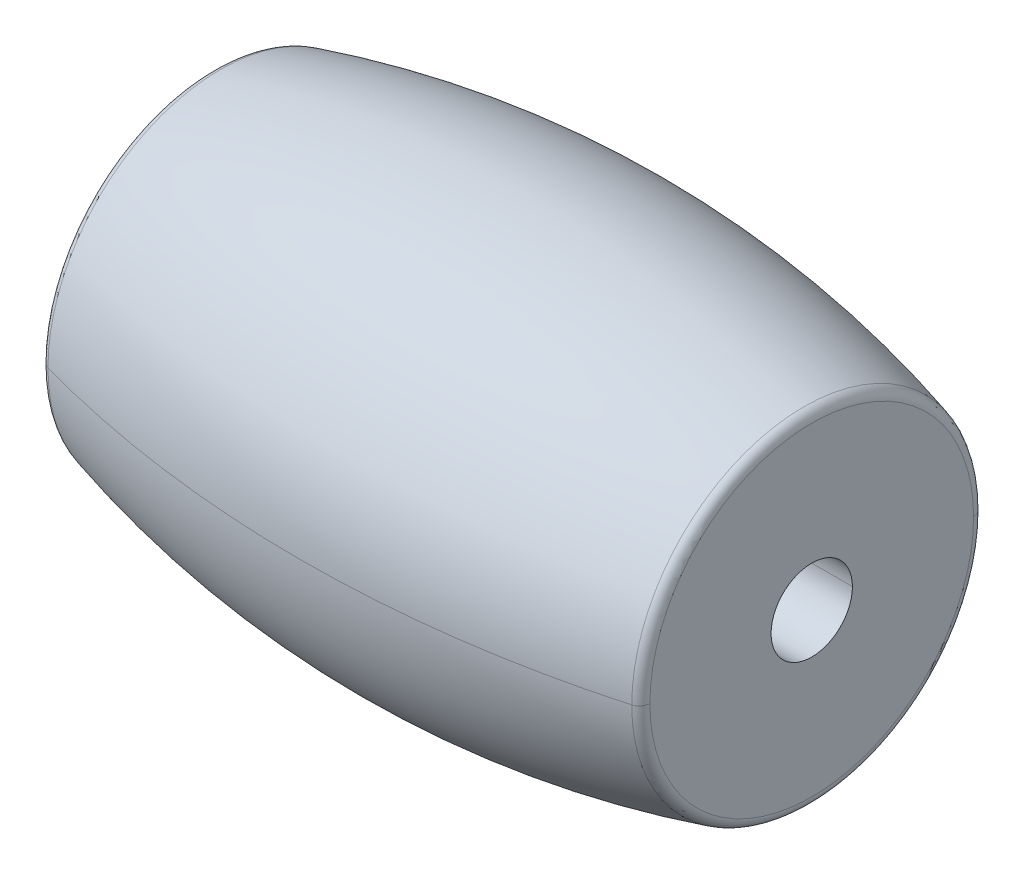
ISO-10303-21;
HEADER;
FILE_DESCRIPTION(('STEP AP214'),'2;1');
FILE_NAME('part.step','',(''),(''),'','','');
FILE_SCHEMA(('AUTOMOTIVE_DESIGN { 1 0 10303 214 1 1 1 1 }'));
ENDSEC;
DATA;
#1=APPLICATION_CONTEXT('core data for automotive mechanical design processes');
#2=APPLICATION_PROTOCOL_DEFINITION('international standard','automotive_design',2000,#1);
#3=PRODUCT_CONTEXT('',#1,'mechanical');
#4=PRODUCT('Part','Part','',(#3));
#5=PRODUCT_RELATED_PRODUCT_CATEGORY('part','',(#4));
#6=PRODUCT_DEFINITION_FORMATION('','',#4);
#7=PRODUCT_DEFINITION_CONTEXT('part definition',#1,'design');
#8=PRODUCT_DEFINITION('design','',#6,#7);
#9=PRODUCT_DEFINITION_SHAPE('','',#8);
#10=(LENGTH_UNIT() NAMED_UNIT(*) SI_UNIT(.MILLI.,.METRE.));
#11=(NAMED_UNIT(*) PLANE_ANGLE_UNIT() SI_UNIT($,.RADIAN.));
#12=(NAMED_UNIT(*) SI_UNIT($,.STERADIAN.) SOLID_ANGLE_UNIT());
#13=UNCERTAINTY_MEASURE_WITH_UNIT(LENGTH_MEASURE(1.E-05),#10,'distance_accuracy_value','');
#14=(GEOMETRIC_REPRESENTATION_CONTEXT(3) GLOBAL_UNCERTAINTY_ASSIGNED_CONTEXT((#13)) GLOBAL_UNIT_ASSIGNED_CONTEXT((#10,
#11,#12)) REPRESENTATION_CONTEXT('',''));
#15=CARTESIAN_POINT('',(0.,0.,0.));
#16=DIRECTION('',(0.,0.,1.));
#17=DIRECTION('',(1.,0.,0.));
#18=AXIS2_PLACEMENT_3D('',#15,#16,#17);
#19=CARTESIAN_POINT('',(13.5,0.,0.));
#20=DIRECTION('',(-1.,0.,0.));
#21=DIRECTION('',(0.,0.,1.));
#22=AXIS2_PLACEMENT_3D('',#19,#20,#21);
#23=TOROIDAL_SURFACE('',#22,7.55923887502749,0.5);
#24=CARTESIAN_POINT('',(14.,0.,0.));
#25=DIRECTION('',(1.,0.,0.));
#26=DIRECTION('',(0.,0.,1.));
#27=AXIS2_PLACEMENT_3D('',#24,#25,#26);
#28=CIRCLE('',#27,7.55923887502749);
#29=CARTESIAN_POINT('',(14.,0.,-7.55923887502749));
#30=VERTEX_POINT('',#29);
#31=CARTESIAN_POINT('',(14.,0.,7.55923887502749));
#32=VERTEX_POINT('',#31);
#33=EDGE_CURVE('E41',#30,#32,#28,.T.);
#34=ORIENTED_EDGE('',*,*,#33,.F.);
#35=CARTESIAN_POINT('',(13.5,0.,-7.55923887502749));
#36=DIRECTION('',(0.,1.,0.));
#37=DIRECTION('',(0.,0.,1.));
#38=AXIS2_PLACEMENT_3D('',#35,#36,#37);
#39=CIRCLE('',#38,0.5);
#40=CARTESIAN_POINT('',(13.6341948310139,0.,-8.04089409126536));
#41=VERTEX_POINT('',#40);
#42=EDGE_CURVE('E11',#30,#41,#39,.T.);
#43=ORIENTED_EDGE('',*,*,#42,.T.);
#44=CARTESIAN_POINT('',(13.6341948310139,0.,0.));
#45=DIRECTION('',(-1.,0.,0.));
#46=DIRECTION('',(0.,0.,1.));
#47=AXIS2_PLACEMENT_3D('',#44,#45,#46);
#48=CIRCLE('',#47,8.04089409126536);
#49=CARTESIAN_POINT('',(13.6341948310139,0.,8.04089409126536));
#50=VERTEX_POINT('',#49);
#51=EDGE_CURVE('E120',#50,#41,#48,.T.);
#52=ORIENTED_EDGE('',*,*,#51,.F.);
#53=CARTESIAN_POINT('',(13.5,0.,7.55923887502749));
#54=DIRECTION('',(0.,-1.,0.));
#55=DIRECTION('',(0.,0.,-1.));
#56=AXIS2_PLACEMENT_3D('',#53,#54,#55);
#57=CIRCLE('',#56,0.5);
#58=EDGE_CURVE('E106',#32,#50,#57,.T.);
#59=ORIENTED_EDGE('',*,*,#58,.F.);
#60=EDGE_LOOP('',(#34,#43,#52,#59));
#61=FACE_BOUND('',#60,.T.);
#62=ADVANCED_FACE('F16',(#61),#23,.T.);
#63=CARTESIAN_POINT('',(-13.5,0.,0.));
#64=DIRECTION('',(1.,0.,0.));
#65=DIRECTION('',(0.,0.,-1.));
#66=AXIS2_PLACEMENT_3D('',#63,#64,#65);
#67=TOROIDAL_SURFACE('',#66,7.55923887502749,0.5);
#68=CARTESIAN_POINT('',(-14.,0.,0.));
#69=DIRECTION('',(-1.,0.,0.));
#70=DIRECTION('',(0.,0.,-1.));
#71=AXIS2_PLACEMENT_3D('',#68,#69,#70);
#72=CIRCLE('',#71,7.55923887502749);
#73=CARTESIAN_POINT('',(-14.,0.,7.55923887502749));
#74=VERTEX_POINT('',#73);
#75=CARTESIAN_POINT('',(-14.,0.,-7.55923887502749));
#76=VERTEX_POINT('',#75);
#77=EDGE_CURVE('E132',#74,#76,#72,.T.);
#78=ORIENTED_EDGE('',*,*,#77,.F.);
#79=CARTESIAN_POINT('',(-13.5,0.,7.55923887502749));
#80=DIRECTION('',(0.,1.,0.));
#81=DIRECTION('',(0.,0.,1.));
#82=AXIS2_PLACEMENT_3D('',#79,#80,#81);
#83=CIRCLE('',#82,0.5);
#84=CARTESIAN_POINT('',(-13.6341948310139,0.,8.04089409126536));
#85=VERTEX_POINT('',#84);
#86=EDGE_CURVE('E27',#74,#85,#83,.T.);
#87=ORIENTED_EDGE('',*,*,#86,.T.);
#88=CARTESIAN_POINT('',(-13.6341948310139,0.,0.));
#89=DIRECTION('',(1.,0.,0.));
#90=DIRECTION('',(0.,0.,-1.));
#91=AXIS2_PLACEMENT_3D('',#88,#89,#90);
#92=CIRCLE('',#91,8.04089409126536);
#93=CARTESIAN_POINT('',(-13.6341948310139,0.,-8.04089409126536));
#94=VERTEX_POINT('',#93);
#95=EDGE_CURVE('E109',#94,#85,#92,.T.);
#96=ORIENTED_EDGE('',*,*,#95,.F.);
#97=CARTESIAN_POINT('',(-13.5,0.,-7.55923887502749));
#98=DIRECTION('',(0.,-1.,0.));
#99=DIRECTION('',(0.,0.,-1.));
#100=AXIS2_PLACEMENT_3D('',#97,#98,#99);
#101=CIRCLE('',#100,0.5);
#102=EDGE_CURVE('E95',#76,#94,#101,.T.);
#103=ORIENTED_EDGE('',*,*,#102,.F.);
#104=EDGE_LOOP('',(#78,#87,#96,#103));
#105=FACE_BOUND('',#104,.T.);
#106=ADVANCED_FACE('F111',(#105),#67,.T.);
#107=CARTESIAN_POINT('',(0.,0.,0.));
#108=DIRECTION('',(-1.,0.,0.));
#109=DIRECTION('',(0.,0.,1.));
#110=AXIS2_PLACEMENT_3D('',#107,#108,#109);
#111=CYLINDRICAL_SURFACE('',#110,1.9);
#112=CARTESIAN_POINT('',(14.,0.,0.));
#113=DIRECTION('',(-1.,0.,0.));
#114=DIRECTION('',(0.,0.,1.));
#115=AXIS2_PLACEMENT_3D('',#112,#113,#114);
#116=CIRCLE('',#115,1.9);
#117=CARTESIAN_POINT('',(14.,0.,-1.9));
#118=VERTEX_POINT('',#117);
#119=CARTESIAN_POINT('',(14.,0.,1.9));
#120=VERTEX_POINT('',#119);
#121=EDGE_CURVE('E105',#118,#120,#116,.T.);
#122=ORIENTED_EDGE('',*,*,#121,.F.);
#123=DIRECTION('',(-1.,0.,0.));
#124=VECTOR('',#123,1.);
#125=CARTESIAN_POINT('',(0.,0.,-1.9));
#126=LINE('',#125,#124);
#127=CARTESIAN_POINT('',(-14.,0.,-1.9));
#128=VERTEX_POINT('',#127);
#129=EDGE_CURVE('E138',#118,#128,#126,.T.);
#130=ORIENTED_EDGE('',*,*,#129,.T.);
#131=CARTESIAN_POINT('',(-14.,0.,0.));
#132=DIRECTION('',(-1.,0.,0.));
#133=DIRECTION('',(0.,0.,1.));
#134=AXIS2_PLACEMENT_3D('',#131,#132,#133);
#135=CIRCLE('',#134,1.9);
#136=CARTESIAN_POINT('',(-14.,0.,1.9));
#137=VERTEX_POINT('',#136);
#138=EDGE_CURVE('E141',#128,#137,#135,.T.);
#139=ORIENTED_EDGE('',*,*,#138,.T.);
#140=DIRECTION('',(-1.,0.,0.));
#141=VECTOR('',#140,1.);
#142=CARTESIAN_POINT('',(0.,0.,1.9));
#143=LINE('',#142,#141);
#144=EDGE_CURVE('E145',#120,#137,#143,.T.);
#145=ORIENTED_EDGE('',*,*,#144,.F.);
#146=EDGE_LOOP('',(#122,#130,#139,#145));
#147=FACE_BOUND('',#146,.T.);
#148=ADVANCED_FACE('F197',(#147),#111,.F.);
#149=CARTESIAN_POINT('',(0.,0.,0.));
#150=DIRECTION('',(-1.,0.,0.));
#151=DIRECTION('',(0.,0.,-1.));
#152=AXIS2_PLACEMENT_3D('',#149,#150,#151);
#153=DEGENERATE_TOROIDAL_SURFACE('',#152,40.8952758785019,50.8,.F.);
#154=ORIENTED_EDGE('',*,*,#51,.T.);
#155=CARTESIAN_POINT('',(0.,0.,40.8952758785019));
#156=DIRECTION('',(0.,1.,0.));
#157=DIRECTION('',(0.,0.,1.));
#158=AXIS2_PLACEMENT_3D('',#155,#156,#157);
#159=CIRCLE('',#158,50.8);
#160=EDGE_CURVE('E114',#41,#94,#159,.T.);
#161=ORIENTED_EDGE('',*,*,#160,.T.);
#162=ORIENTED_EDGE('',*,*,#95,.T.);
#163=CARTESIAN_POINT('',(0.,0.,-40.8952758785019));
#164=DIRECTION('',(0.,-1.,0.));
#165=DIRECTION('',(0.,0.,-1.));
#166=AXIS2_PLACEMENT_3D('',#163,#164,#165);
#167=CIRCLE('',#166,50.8);
#168=EDGE_CURVE('E86',#50,#85,#167,.T.);
#169=ORIENTED_EDGE('',*,*,#168,.F.);
#170=EDGE_LOOP('',(#154,#161,#162,#169));
#171=FACE_BOUND('',#170,.T.);
#172=ADVANCED_FACE('F118',(#171),#153,.F.);
#173=CARTESIAN_POINT('',(0.,0.,0.));
#174=DIRECTION('',(-1.,0.,0.));
#175=DIRECTION('',(0.,0.,-1.));
#176=AXIS2_PLACEMENT_3D('',#173,#174,#175);
#177=DEGENERATE_TOROIDAL_SURFACE('',#176,40.8952758785019,50.8,.F.);
#178=ORIENTED_EDGE('',*,*,#160,.F.);
#179=CARTESIAN_POINT('',(13.6341948310139,0.,0.));
#180=DIRECTION('',(-1.,0.,0.));
#181=DIRECTION('',(0.,0.,1.));
#182=AXIS2_PLACEMENT_3D('',#179,#180,#181);
#183=CIRCLE('',#182,8.04089409126536);
#184=EDGE_CURVE('E115',#41,#50,#183,.T.);
#185=ORIENTED_EDGE('',*,*,#184,.T.);
#186=ORIENTED_EDGE('',*,*,#168,.T.);
#187=CARTESIAN_POINT('',(-13.6341948310139,0.,0.));
#188=DIRECTION('',(1.,0.,0.));
#189=DIRECTION('',(0.,0.,-1.));
#190=AXIS2_PLACEMENT_3D('',#187,#188,#189);
#191=CIRCLE('',#190,8.04089409126536);
#192=EDGE_CURVE('E99',#85,#94,#191,.T.);
#193=ORIENTED_EDGE('',*,*,#192,.T.);
#194=EDGE_LOOP('',(#178,#185,#186,#193));
#195=FACE_BOUND('',#194,.T.);
#196=ADVANCED_FACE('F123',(#195),#177,.F.);
#197=CARTESIAN_POINT('',(-14.,7.9375,0.));
#198=DIRECTION('',(1.,0.,0.));
#199=DIRECTION('',(0.,1.,0.));
#200=AXIS2_PLACEMENT_3D('',#197,#198,#199);
#201=PLANE('',#200);
#202=CARTESIAN_POINT('',(-14.,0.,0.));
#203=DIRECTION('',(-1.,0.,0.));
#204=DIRECTION('',(0.,0.,-1.));
#205=AXIS2_PLACEMENT_3D('',#202,#203,#204);
#206=CIRCLE('',#205,7.55923887502749);
#207=EDGE_CURVE('E101',#76,#74,#206,.T.);
#208=ORIENTED_EDGE('',*,*,#207,.T.);
#209=ORIENTED_EDGE('',*,*,#77,.T.);
#210=EDGE_LOOP('',(#208,#209));
#211=FACE_BOUND('',#210,.T.);
#212=CARTESIAN_POINT('',(-14.,0.,0.));
#213=DIRECTION('',(-1.,0.,0.));
#214=DIRECTION('',(0.,0.,1.));
#215=AXIS2_PLACEMENT_3D('',#212,#213,#214);
#216=CIRCLE('',#215,1.9);
#217=EDGE_CURVE('E151',#137,#128,#216,.T.);
#218=ORIENTED_EDGE('',*,*,#217,.F.);
#219=ORIENTED_EDGE('',*,*,#138,.F.);
#220=EDGE_LOOP('',(#218,#219));
#221=FACE_BOUND('',#220,.T.);
#222=ADVANCED_FACE('F196',(#211,#221),#201,.F.);
#223=CARTESIAN_POINT('',(0.,0.,0.));
#224=DIRECTION('',(-1.,0.,0.));
#225=DIRECTION('',(0.,0.,1.));
#226=AXIS2_PLACEMENT_3D('',#223,#224,#225);
#227=CYLINDRICAL_SURFACE('',#226,1.9);
#228=ORIENTED_EDGE('',*,*,#129,.F.);
#229=CARTESIAN_POINT('',(14.,0.,0.));
#230=DIRECTION('',(-1.,0.,0.));
#231=DIRECTION('',(0.,0.,1.));
#232=AXIS2_PLACEMENT_3D('',#229,#230,#231);
#233=CIRCLE('',#232,1.9);
#234=EDGE_CURVE('E136',#120,#118,#233,.T.);
#235=ORIENTED_EDGE('',*,*,#234,.F.);
#236=ORIENTED_EDGE('',*,*,#144,.T.);
#237=ORIENTED_EDGE('',*,*,#217,.T.);
#238=EDGE_LOOP('',(#228,#235,#236,#237));
#239=FACE_BOUND('',#238,.T.);
#240=ADVANCED_FACE('F194',(#239),#227,.F.);
#241=CARTESIAN_POINT('',(14.,1.9,0.));
#242=DIRECTION('',(-1.,0.,0.));
#243=DIRECTION('',(0.,0.,1.));
#244=AXIS2_PLACEMENT_3D('',#241,#242,#243);
#245=PLANE('',#244);
#246=CARTESIAN_POINT('',(14.,0.,0.));
#247=DIRECTION('',(1.,0.,0.));
#248=DIRECTION('',(0.,0.,1.));
#249=AXIS2_PLACEMENT_3D('',#246,#247,#248);
#250=CIRCLE('',#249,7.55923887502749);
#251=EDGE_CURVE('E20',#32,#30,#250,.T.);
#252=ORIENTED_EDGE('',*,*,#251,.T.);
#253=ORIENTED_EDGE('',*,*,#33,.T.);
#254=EDGE_LOOP('',(#252,#253));
#255=FACE_BOUND('',#254,.T.);
#256=ORIENTED_EDGE('',*,*,#234,.T.);
#257=ORIENTED_EDGE('',*,*,#121,.T.);
#258=EDGE_LOOP('',(#256,#257));
#259=FACE_BOUND('',#258,.T.);
#260=ADVANCED_FACE('F18',(#255,#259),#245,.F.);
#261=CARTESIAN_POINT('',(-13.5,0.,0.));
#262=DIRECTION('',(1.,0.,0.));
#263=DIRECTION('',(0.,0.,-1.));
#264=AXIS2_PLACEMENT_3D('',#261,#262,#263);
#265=TOROIDAL_SURFACE('',#264,7.55923887502749,0.5);
#266=ORIENTED_EDGE('',*,*,#86,.F.);
#267=ORIENTED_EDGE('',*,*,#207,.F.);
#268=ORIENTED_EDGE('',*,*,#102,.T.);
#269=ORIENTED_EDGE('',*,*,#192,.F.);
#270=EDGE_LOOP('',(#266,#267,#268,#269));
#271=FACE_BOUND('',#270,.T.);
#272=ADVANCED_FACE('F98',(#271),#265,.T.);
#273=CARTESIAN_POINT('',(13.5,0.,0.));
#274=DIRECTION('',(-1.,0.,0.));
#275=DIRECTION('',(0.,0.,1.));
#276=AXIS2_PLACEMENT_3D('',#273,#274,#275);
#277=TOROIDAL_SURFACE('',#276,7.55923887502749,0.5);
#278=ORIENTED_EDGE('',*,*,#42,.F.);
#279=ORIENTED_EDGE('',*,*,#251,.F.);
#280=ORIENTED_EDGE('',*,*,#58,.T.);
#281=ORIENTED_EDGE('',*,*,#184,.F.);
#282=EDGE_LOOP('',(#278,#279,#280,#281));
#283=FACE_BOUND('',#282,.T.);
#284=ADVANCED_FACE('F182',(#283),#277,.T.);
#285=CLOSED_SHELL('',(#62,#106,#148,#172,#196,#222,#240,#260,#272,#284));
#286=MANIFOLD_SOLID_BREP('B1',#285);
#287=ADVANCED_BREP_SHAPE_REPRESENTATION('',(#18,#286),#14);
#288=SHAPE_DEFINITION_REPRESENTATION(#9,#287);
ENDSEC;
END-ISO-10303-21;
